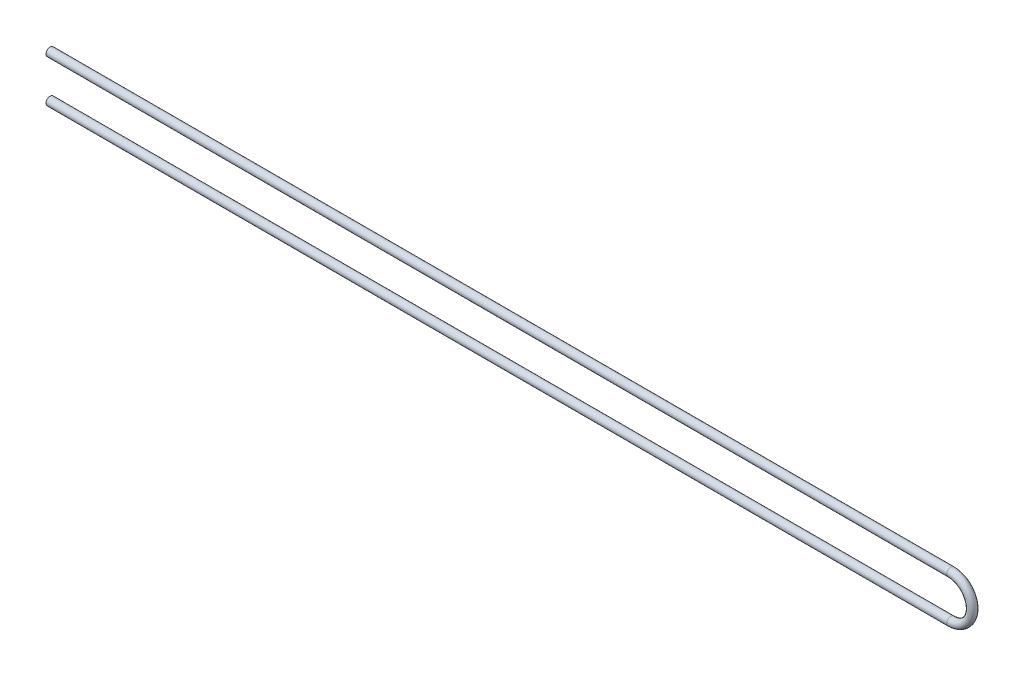
ISO-10303-21;
HEADER;
FILE_DESCRIPTION(('STEP AP214'),'2;1');
FILE_NAME('part.step','',(''),(''),'','','');
FILE_SCHEMA(('AUTOMOTIVE_DESIGN { 1 0 10303 214 1 1 1 1 }'));
ENDSEC;
DATA;
#1=APPLICATION_CONTEXT('core data for automotive mechanical design processes');
#2=APPLICATION_PROTOCOL_DEFINITION('international standard','automotive_design',2000,#1);
#3=PRODUCT_CONTEXT('',#1,'mechanical');
#4=PRODUCT('Part','Part','',(#3));
#5=PRODUCT_RELATED_PRODUCT_CATEGORY('part','',(#4));
#6=PRODUCT_DEFINITION_FORMATION('','',#4);
#7=PRODUCT_DEFINITION_CONTEXT('part definition',#1,'design');
#8=PRODUCT_DEFINITION('design','',#6,#7);
#9=PRODUCT_DEFINITION_SHAPE('','',#8);
#10=(LENGTH_UNIT() NAMED_UNIT(*) SI_UNIT(.MILLI.,.METRE.));
#11=(NAMED_UNIT(*) PLANE_ANGLE_UNIT() SI_UNIT($,.RADIAN.));
#12=(NAMED_UNIT(*) SI_UNIT($,.STERADIAN.) SOLID_ANGLE_UNIT());
#13=UNCERTAINTY_MEASURE_WITH_UNIT(LENGTH_MEASURE(1.E-05),#10,'distance_accuracy_value','');
#14=(GEOMETRIC_REPRESENTATION_CONTEXT(3) GLOBAL_UNCERTAINTY_ASSIGNED_CONTEXT((#13)) GLOBAL_UNIT_ASSIGNED_CONTEXT((#10,
#11,#12)) REPRESENTATION_CONTEXT('',''));
#15=CARTESIAN_POINT('',(0.,0.,0.));
#16=DIRECTION('',(0.,0.,1.));
#17=DIRECTION('',(1.,0.,0.));
#18=AXIS2_PLACEMENT_3D('',#15,#16,#17);
#19=CARTESIAN_POINT('',(0.,0.,0.));
#20=DIRECTION('',(-1.,0.,0.));
#21=DIRECTION('',(0.,-1.,0.));
#22=AXIS2_PLACEMENT_3D('',#19,#20,#21);
#23=PLANE('',#22);
#24=CARTESIAN_POINT('',(0.,0.,0.));
#25=DIRECTION('',(-1.,0.,0.));
#26=DIRECTION('',(0.,-1.,0.));
#27=AXIS2_PLACEMENT_3D('',#24,#25,#26);
#28=CIRCLE('',#27,10.15);
#29=CARTESIAN_POINT('',(0.,-10.15,0.));
#30=VERTEX_POINT('',#29);
#31=EDGE_CURVE('E72',#30,#30,#28,.T.);
#32=ORIENTED_EDGE('',*,*,#31,.F.);
#33=EDGE_LOOP('',(#32));
#34=FACE_BOUND('',#33,.T.);
#35=CARTESIAN_POINT('',(0.,0.,0.));
#36=DIRECTION('',(-1.,0.,0.));
#37=DIRECTION('',(0.,-1.,0.));
#38=AXIS2_PLACEMENT_3D('',#35,#36,#37);
#39=CIRCLE('',#38,10.65);
#40=CARTESIAN_POINT('',(0.,-10.65,0.));
#41=VERTEX_POINT('',#40);
#42=EDGE_CURVE('E63',#41,#41,#39,.T.);
#43=ORIENTED_EDGE('',*,*,#42,.T.);
#44=EDGE_LOOP('',(#43));
#45=FACE_BOUND('',#44,.T.);
#46=ADVANCED_FACE('F49',(#34,#45),#23,.T.);
#47=CARTESIAN_POINT('',(0.,-110.,0.));
#48=DIRECTION('',(1.,0.,0.));
#49=DIRECTION('',(0.,1.,0.));
#50=AXIS2_PLACEMENT_3D('',#47,#48,#49);
#51=PLANE('',#50);
#52=CARTESIAN_POINT('',(0.,-110.,0.));
#53=DIRECTION('',(1.,0.,0.));
#54=DIRECTION('',(0.,1.,0.));
#55=AXIS2_PLACEMENT_3D('',#52,#53,#54);
#56=CIRCLE('',#55,10.15);
#57=CARTESIAN_POINT('',(0.,-99.8500000000003,0.));
#58=VERTEX_POINT('',#57);
#59=EDGE_CURVE('E68',#58,#58,#56,.T.);
#60=ORIENTED_EDGE('',*,*,#59,.T.);
#61=EDGE_LOOP('',(#60));
#62=FACE_BOUND('',#61,.T.);
#63=CARTESIAN_POINT('',(0.,-110.,0.));
#64=DIRECTION('',(1.,0.,0.));
#65=DIRECTION('',(0.,1.,0.));
#66=AXIS2_PLACEMENT_3D('',#63,#64,#65);
#67=CIRCLE('',#66,10.65);
#68=CARTESIAN_POINT('',(0.,-99.3500000000003,0.));
#69=VERTEX_POINT('',#68);
#70=EDGE_CURVE('E11',#69,#69,#67,.T.);
#71=ORIENTED_EDGE('',*,*,#70,.F.);
#72=EDGE_LOOP('',(#71));
#73=FACE_BOUND('',#72,.T.);
#74=ADVANCED_FACE('F92',(#62,#73),#51,.F.);
#75=CARTESIAN_POINT('',(0.,0.,0.));
#76=DIRECTION('',(1.,0.,0.));
#77=DIRECTION('',(0.,0.,-1.));
#78=AXIS2_PLACEMENT_3D('',#75,#76,#77);
#79=CYLINDRICAL_SURFACE('',#78,10.65);
#80=CARTESIAN_POINT('',(2325.,0.,0.));
#81=DIRECTION('',(-1.,0.,0.));
#82=DIRECTION('',(0.,-1.,0.));
#83=AXIS2_PLACEMENT_3D('',#80,#81,#82);
#84=CIRCLE('',#83,10.65);
#85=CARTESIAN_POINT('',(2325.,10.65,0.));
#86=VERTEX_POINT('',#85);
#87=EDGE_CURVE('E59',#86,#86,#84,.T.);
#88=ORIENTED_EDGE('',*,*,#87,.T.);
#89=EDGE_LOOP('',(#88));
#90=FACE_BOUND('',#89,.T.);
#91=ORIENTED_EDGE('',*,*,#42,.F.);
#92=EDGE_LOOP('',(#91));
#93=FACE_BOUND('',#92,.T.);
#94=ADVANCED_FACE('F96',(#90,#93),#79,.T.);
#95=CARTESIAN_POINT('',(2325.,-55.,0.));
#96=DIRECTION('',(0.,0.,-1.));
#97=DIRECTION('',(-1.,0.,0.));
#98=AXIS2_PLACEMENT_3D('',#95,#96,#97);
#99=TOROIDAL_SURFACE('',#98,55.,10.65);
#100=CARTESIAN_POINT('',(2325.,-110.,0.));
#101=DIRECTION('',(1.,0.,0.));
#102=DIRECTION('',(0.,1.,0.));
#103=AXIS2_PLACEMENT_3D('',#100,#101,#102);
#104=CIRCLE('',#103,10.65);
#105=CARTESIAN_POINT('',(2325.,-120.65,0.));
#106=VERTEX_POINT('',#105);
#107=EDGE_CURVE('E55',#106,#106,#104,.T.);
#108=CARTESIAN_POINT('',(2325.,-55.,0.));
#109=DIRECTION('',(0.,0.,-1.));
#110=DIRECTION('',(-1.,0.,0.));
#111=AXIS2_PLACEMENT_3D('',#108,#109,#110);
#112=CIRCLE('',#111,65.65);
#113=EDGE_CURVE('',#86,#106,#112,.T.);
#114=ORIENTED_EDGE('',*,*,#87,.F.);
#115=ORIENTED_EDGE('',*,*,#107,.T.);
#116=ORIENTED_EDGE('',*,*,#113,.T.);
#117=ORIENTED_EDGE('',*,*,#113,.F.);
#118=EDGE_LOOP('',(#114,#116,#115,#117));
#119=FACE_BOUND('',#118,.T.);
#120=ADVANCED_FACE('F98',(#119),#99,.T.);
#121=CARTESIAN_POINT('',(2325.,-110.,0.));
#122=DIRECTION('',(-1.,0.,0.));
#123=DIRECTION('',(0.,-1.,0.));
#124=AXIS2_PLACEMENT_3D('',#121,#122,#123);
#125=CYLINDRICAL_SURFACE('',#124,10.65);
#126=ORIENTED_EDGE('',*,*,#70,.T.);
#127=EDGE_LOOP('',(#126));
#128=FACE_BOUND('',#127,.T.);
#129=ORIENTED_EDGE('',*,*,#107,.F.);
#130=EDGE_LOOP('',(#129));
#131=FACE_BOUND('',#130,.T.);
#132=ADVANCED_FACE('F86',(#128,#131),#125,.T.);
#133=CARTESIAN_POINT('',(0.,0.,0.));
#134=DIRECTION('',(1.,0.,0.));
#135=DIRECTION('',(0.,0.,-1.));
#136=AXIS2_PLACEMENT_3D('',#133,#134,#135);
#137=CYLINDRICAL_SURFACE('',#136,10.15);
#138=CARTESIAN_POINT('',(2325.,0.,0.));
#139=DIRECTION('',(1.,0.,0.));
#140=DIRECTION('',(0.,0.,-1.));
#141=AXIS2_PLACEMENT_3D('',#138,#139,#140);
#142=CIRCLE('',#141,10.15);
#143=CARTESIAN_POINT('',(2325.,10.15,0.));
#144=VERTEX_POINT('',#143);
#145=EDGE_CURVE('E75',#144,#144,#142,.F.);
#146=ORIENTED_EDGE('',*,*,#145,.F.);
#147=EDGE_LOOP('',(#146));
#148=FACE_BOUND('',#147,.T.);
#149=ORIENTED_EDGE('',*,*,#31,.T.);
#150=EDGE_LOOP('',(#149));
#151=FACE_BOUND('',#150,.T.);
#152=ADVANCED_FACE('F83',(#148,#151),#137,.F.);
#153=CARTESIAN_POINT('',(2325.,-55.,0.));
#154=DIRECTION('',(0.,0.,-1.));
#155=DIRECTION('',(-1.,0.,0.));
#156=AXIS2_PLACEMENT_3D('',#153,#154,#155);
#157=TOROIDAL_SURFACE('',#156,55.,10.15);
#158=CARTESIAN_POINT('',(2325.,-110.,0.));
#159=DIRECTION('',(1.,0.,0.));
#160=DIRECTION('',(0.,1.,0.));
#161=AXIS2_PLACEMENT_3D('',#158,#159,#160);
#162=CIRCLE('',#161,10.15);
#163=CARTESIAN_POINT('',(2325.,-120.15,0.));
#164=VERTEX_POINT('',#163);
#165=EDGE_CURVE('E71',#164,#164,#162,.T.);
#166=CARTESIAN_POINT('',(2325.,-55.,0.));
#167=DIRECTION('',(0.,0.,-1.));
#168=DIRECTION('',(-1.,0.,0.));
#169=AXIS2_PLACEMENT_3D('',#166,#167,#168);
#170=CIRCLE('',#169,65.15);
#171=EDGE_CURVE('',#144,#164,#170,.T.);
#172=ORIENTED_EDGE('',*,*,#145,.T.);
#173=ORIENTED_EDGE('',*,*,#165,.F.);
#174=ORIENTED_EDGE('',*,*,#171,.T.);
#175=ORIENTED_EDGE('',*,*,#171,.F.);
#176=EDGE_LOOP('',(#172,#174,#173,#175));
#177=FACE_BOUND('',#176,.T.);
#178=ADVANCED_FACE('F81',(#177),#157,.F.);
#179=CARTESIAN_POINT('',(2325.,-110.,0.));
#180=DIRECTION('',(-1.,0.,0.));
#181=DIRECTION('',(0.,-1.,0.));
#182=AXIS2_PLACEMENT_3D('',#179,#180,#181);
#183=CYLINDRICAL_SURFACE('',#182,10.15);
#184=ORIENTED_EDGE('',*,*,#59,.F.);
#185=EDGE_LOOP('',(#184));
#186=FACE_BOUND('',#185,.T.);
#187=ORIENTED_EDGE('',*,*,#165,.T.);
#188=EDGE_LOOP('',(#187));
#189=FACE_BOUND('',#188,.T.);
#190=ADVANCED_FACE('F93',(#186,#189),#183,.F.);
#191=CLOSED_SHELL('',(#46,#74,#94,#120,#132,#152,#178,#190));
#192=MANIFOLD_SOLID_BREP('B2',#191);
#193=ADVANCED_BREP_SHAPE_REPRESENTATION('',(#18,#192),#14);
#194=SHAPE_DEFINITION_REPRESENTATION(#9,#193);
ENDSEC;
END-ISO-10303-21;
